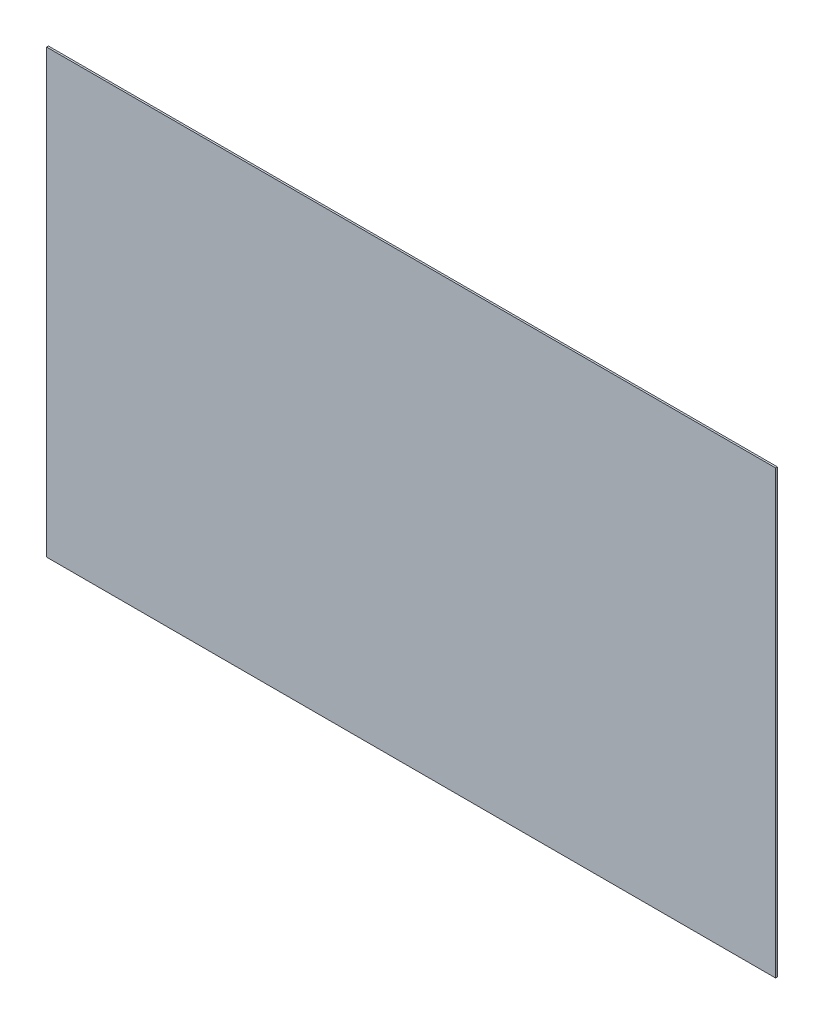
ISO-10303-21;
HEADER;
FILE_DESCRIPTION(('STEP AP214'),'2;1');
FILE_NAME('part.step','',(''),(''),'','','');
FILE_SCHEMA(('AUTOMOTIVE_DESIGN { 1 0 10303 214 1 1 1 1 }'));
ENDSEC;
DATA;
#1=APPLICATION_CONTEXT('core data for automotive mechanical design processes');
#2=APPLICATION_PROTOCOL_DEFINITION('international standard','automotive_design',2000,#1);
#3=PRODUCT_CONTEXT('',#1,'mechanical');
#4=PRODUCT('Part','Part','',(#3));
#5=PRODUCT_RELATED_PRODUCT_CATEGORY('part','',(#4));
#6=PRODUCT_DEFINITION_FORMATION('','',#4);
#7=PRODUCT_DEFINITION_CONTEXT('part definition',#1,'design');
#8=PRODUCT_DEFINITION('design','',#6,#7);
#9=PRODUCT_DEFINITION_SHAPE('','',#8);
#10=(LENGTH_UNIT() NAMED_UNIT(*) SI_UNIT(.MILLI.,.METRE.));
#11=(NAMED_UNIT(*) PLANE_ANGLE_UNIT() SI_UNIT($,.RADIAN.));
#12=(NAMED_UNIT(*) SI_UNIT($,.STERADIAN.) SOLID_ANGLE_UNIT());
#13=UNCERTAINTY_MEASURE_WITH_UNIT(LENGTH_MEASURE(1.E-05),#10,'distance_accuracy_value','');
#14=(GEOMETRIC_REPRESENTATION_CONTEXT(3) GLOBAL_UNCERTAINTY_ASSIGNED_CONTEXT((#13)) GLOBAL_UNIT_ASSIGNED_CONTEXT((#10,
#11,#12)) REPRESENTATION_CONTEXT('',''));
#15=CARTESIAN_POINT('',(0.,0.,0.));
#16=DIRECTION('',(0.,0.,1.));
#17=DIRECTION('',(1.,0.,0.));
#18=AXIS2_PLACEMENT_3D('',#15,#16,#17);
#19=CARTESIAN_POINT('',(0.,0.,1.5875));
#20=DIRECTION('',(1.,0.,0.));
#21=DIRECTION('',(0.,0.,-1.));
#22=AXIS2_PLACEMENT_3D('',#19,#20,#21);
#23=PLANE('',#22);
#24=DIRECTION('',(0.,-1.,0.));
#25=VECTOR('',#24,1.);
#26=CARTESIAN_POINT('',(0.,0.,0.));
#27=LINE('',#26,#25);
#28=CARTESIAN_POINT('',(0.,381.,0.));
#29=VERTEX_POINT('',#28);
#30=CARTESIAN_POINT('',(0.,0.,0.));
#31=VERTEX_POINT('',#30);
#32=EDGE_CURVE('E96',#29,#31,#27,.T.);
#33=ORIENTED_EDGE('',*,*,#32,.T.);
#34=DIRECTION('',(0.,0.,-1.));
#35=VECTOR('',#34,1.);
#36=CARTESIAN_POINT('',(0.,0.,1.5875));
#37=LINE('',#36,#35);
#38=CARTESIAN_POINT('',(0.,0.,1.5875));
#39=VERTEX_POINT('',#38);
#40=EDGE_CURVE('E11',#39,#31,#37,.T.);
#41=ORIENTED_EDGE('',*,*,#40,.F.);
#42=DIRECTION('',(0.,-1.,0.));
#43=VECTOR('',#42,1.);
#44=CARTESIAN_POINT('',(0.,0.,1.5875));
#45=LINE('',#44,#43);
#46=CARTESIAN_POINT('',(0.,381.,1.5875));
#47=VERTEX_POINT('',#46);
#48=EDGE_CURVE('E84',#47,#39,#45,.T.);
#49=ORIENTED_EDGE('',*,*,#48,.F.);
#50=DIRECTION('',(0.,0.,-1.));
#51=VECTOR('',#50,1.);
#52=CARTESIAN_POINT('',(0.,381.,1.5875));
#53=LINE('',#52,#51);
#54=EDGE_CURVE('E92',#47,#29,#53,.T.);
#55=ORIENTED_EDGE('',*,*,#54,.T.);
#56=EDGE_LOOP('',(#33,#41,#49,#55));
#57=FACE_BOUND('',#56,.T.);
#58=ADVANCED_FACE('F33',(#57),#23,.F.);
#59=CARTESIAN_POINT('',(0.,0.,1.5875));
#60=DIRECTION('',(0.,1.,0.));
#61=DIRECTION('',(0.,0.,1.));
#62=AXIS2_PLACEMENT_3D('',#59,#60,#61);
#63=PLANE('',#62);
#64=DIRECTION('',(1.,0.,0.));
#65=VECTOR('',#64,1.);
#66=CARTESIAN_POINT('',(0.,0.,0.));
#67=LINE('',#66,#65);
#68=CARTESIAN_POINT('',(628.65,0.,0.));
#69=VERTEX_POINT('',#68);
#70=EDGE_CURVE('E88',#31,#69,#67,.T.);
#71=ORIENTED_EDGE('',*,*,#70,.T.);
#72=DIRECTION('',(0.,0.,-1.));
#73=VECTOR('',#72,1.);
#74=CARTESIAN_POINT('',(628.65,0.,1.5875));
#75=LINE('',#74,#73);
#76=CARTESIAN_POINT('',(628.65,0.,1.5875));
#77=VERTEX_POINT('',#76);
#78=EDGE_CURVE('E41',#77,#69,#75,.T.);
#79=ORIENTED_EDGE('',*,*,#78,.F.);
#80=DIRECTION('',(1.,0.,0.));
#81=VECTOR('',#80,1.);
#82=CARTESIAN_POINT('',(0.,0.,1.5875));
#83=LINE('',#82,#81);
#84=EDGE_CURVE('E79',#39,#77,#83,.T.);
#85=ORIENTED_EDGE('',*,*,#84,.F.);
#86=ORIENTED_EDGE('',*,*,#40,.T.);
#87=EDGE_LOOP('',(#71,#79,#85,#86));
#88=FACE_BOUND('',#87,.T.);
#89=ADVANCED_FACE('F87',(#88),#63,.F.);
#90=CARTESIAN_POINT('',(628.65,0.,1.5875));
#91=DIRECTION('',(-1.,0.,0.));
#92=DIRECTION('',(0.,0.,1.));
#93=AXIS2_PLACEMENT_3D('',#90,#91,#92);
#94=PLANE('',#93);
#95=DIRECTION('',(0.,1.,0.));
#96=VECTOR('',#95,1.);
#97=CARTESIAN_POINT('',(628.65,0.,0.));
#98=LINE('',#97,#96);
#99=CARTESIAN_POINT('',(628.65,381.,0.));
#100=VERTEX_POINT('',#99);
#101=EDGE_CURVE('E66',#69,#100,#98,.T.);
#102=ORIENTED_EDGE('',*,*,#101,.T.);
#103=DIRECTION('',(0.,0.,-1.));
#104=VECTOR('',#103,1.);
#105=CARTESIAN_POINT('',(628.65,381.,1.5875));
#106=LINE('',#105,#104);
#107=CARTESIAN_POINT('',(628.65,381.,1.5875));
#108=VERTEX_POINT('',#107);
#109=EDGE_CURVE('E89',#108,#100,#106,.T.);
#110=ORIENTED_EDGE('',*,*,#109,.F.);
#111=DIRECTION('',(0.,1.,0.));
#112=VECTOR('',#111,1.);
#113=CARTESIAN_POINT('',(628.65,0.,1.5875));
#114=LINE('',#113,#112);
#115=EDGE_CURVE('E82',#77,#108,#114,.T.);
#116=ORIENTED_EDGE('',*,*,#115,.F.);
#117=ORIENTED_EDGE('',*,*,#78,.T.);
#118=EDGE_LOOP('',(#102,#110,#116,#117));
#119=FACE_BOUND('',#118,.T.);
#120=ADVANCED_FACE('F90',(#119),#94,.F.);
#121=CARTESIAN_POINT('',(0.,381.,1.5875));
#122=DIRECTION('',(0.,-1.,0.));
#123=DIRECTION('',(0.,0.,-1.));
#124=AXIS2_PLACEMENT_3D('',#121,#122,#123);
#125=PLANE('',#124);
#126=DIRECTION('',(-1.,0.,0.));
#127=VECTOR('',#126,1.);
#128=CARTESIAN_POINT('',(0.,381.,0.));
#129=LINE('',#128,#127);
#130=EDGE_CURVE('E72',#100,#29,#129,.T.);
#131=ORIENTED_EDGE('',*,*,#130,.T.);
#132=ORIENTED_EDGE('',*,*,#54,.F.);
#133=DIRECTION('',(-1.,0.,0.));
#134=VECTOR('',#133,1.);
#135=CARTESIAN_POINT('',(0.,381.,1.5875));
#136=LINE('',#135,#134);
#137=EDGE_CURVE('E49',#108,#47,#136,.T.);
#138=ORIENTED_EDGE('',*,*,#137,.F.);
#139=ORIENTED_EDGE('',*,*,#109,.T.);
#140=EDGE_LOOP('',(#131,#132,#138,#139));
#141=FACE_BOUND('',#140,.T.);
#142=ADVANCED_FACE('F103',(#141),#125,.F.);
#143=CARTESIAN_POINT('',(0.,0.,1.5875));
#144=DIRECTION('',(0.,0.,-1.));
#145=DIRECTION('',(-1.,0.,0.));
#146=AXIS2_PLACEMENT_3D('',#143,#144,#145);
#147=PLANE('',#146);
#148=ORIENTED_EDGE('',*,*,#48,.T.);
#149=ORIENTED_EDGE('',*,*,#84,.T.);
#150=ORIENTED_EDGE('',*,*,#115,.T.);
#151=ORIENTED_EDGE('',*,*,#137,.T.);
#152=EDGE_LOOP('',(#148,#149,#150,#151));
#153=FACE_BOUND('',#152,.T.);
#154=ADVANCED_FACE('F80',(#153),#147,.F.);
#155=CARTESIAN_POINT('',(0.,0.,0.));
#156=DIRECTION('',(0.,0.,-1.));
#157=DIRECTION('',(-1.,0.,0.));
#158=AXIS2_PLACEMENT_3D('',#155,#156,#157);
#159=PLANE('',#158);
#160=ORIENTED_EDGE('',*,*,#32,.F.);
#161=ORIENTED_EDGE('',*,*,#130,.F.);
#162=ORIENTED_EDGE('',*,*,#101,.F.);
#163=ORIENTED_EDGE('',*,*,#70,.F.);
#164=EDGE_LOOP('',(#160,#161,#162,#163));
#165=FACE_BOUND('',#164,.T.);
#166=ADVANCED_FACE('F106',(#165),#159,.T.);
#167=CLOSED_SHELL('',(#58,#89,#120,#142,#154,#166));
#168=MANIFOLD_SOLID_BREP('B2',#167);
#169=ADVANCED_BREP_SHAPE_REPRESENTATION('',(#18,#168),#14);
#170=SHAPE_DEFINITION_REPRESENTATION(#9,#169);
ENDSEC;
END-ISO-10303-21;
